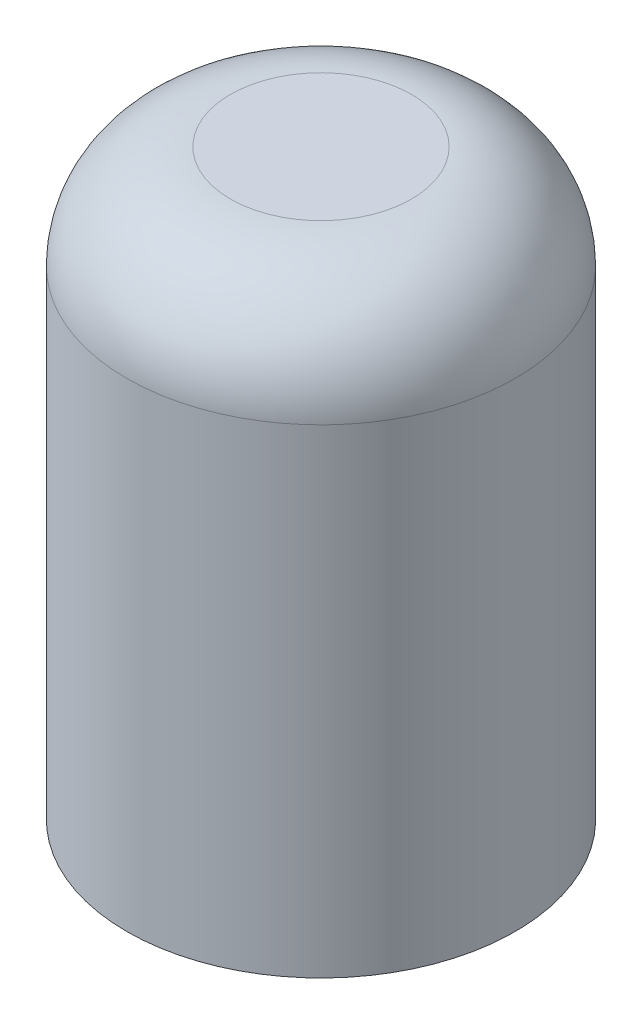
ISO-10303-21;
HEADER;
FILE_DESCRIPTION(('STEP AP214'),'2;1');
FILE_NAME('part.step','',(''),(''),'','','');
FILE_SCHEMA(('AUTOMOTIVE_DESIGN { 1 0 10303 214 1 1 1 1 }'));
ENDSEC;
DATA;
#1=APPLICATION_CONTEXT('core data for automotive mechanical design processes');
#2=APPLICATION_PROTOCOL_DEFINITION('international standard','automotive_design',2000,#1);
#3=PRODUCT_CONTEXT('',#1,'mechanical');
#4=PRODUCT('Part','Part','',(#3));
#5=PRODUCT_RELATED_PRODUCT_CATEGORY('part','',(#4));
#6=PRODUCT_DEFINITION_FORMATION('','',#4);
#7=PRODUCT_DEFINITION_CONTEXT('part definition',#1,'design');
#8=PRODUCT_DEFINITION('design','',#6,#7);
#9=PRODUCT_DEFINITION_SHAPE('','',#8);
#10=(LENGTH_UNIT() NAMED_UNIT(*) SI_UNIT(.MILLI.,.METRE.));
#11=(NAMED_UNIT(*) PLANE_ANGLE_UNIT() SI_UNIT($,.RADIAN.));
#12=(NAMED_UNIT(*) SI_UNIT($,.STERADIAN.) SOLID_ANGLE_UNIT());
#13=UNCERTAINTY_MEASURE_WITH_UNIT(LENGTH_MEASURE(1.E-05),#10,'distance_accuracy_value','');
#14=(GEOMETRIC_REPRESENTATION_CONTEXT(3) GLOBAL_UNCERTAINTY_ASSIGNED_CONTEXT((#13)) GLOBAL_UNIT_ASSIGNED_CONTEXT((#10,
#11,#12)) REPRESENTATION_CONTEXT('',''));
#15=CARTESIAN_POINT('',(0.,0.,0.));
#16=DIRECTION('',(0.,0.,1.));
#17=DIRECTION('',(1.,0.,0.));
#18=AXIS2_PLACEMENT_3D('',#15,#16,#17);
#19=CARTESIAN_POINT('',(0.,14.2875,0.));
#20=DIRECTION('',(0.,-1.,0.));
#21=DIRECTION('',(0.,0.,-1.));
#22=AXIS2_PLACEMENT_3D('',#19,#20,#21);
#23=CYLINDRICAL_SURFACE('',#22,4.7625);
#24=CARTESIAN_POINT('',(0.,11.7475,0.));
#25=DIRECTION('',(0.,1.,0.));
#26=DIRECTION('',(0.,0.,1.));
#27=AXIS2_PLACEMENT_3D('',#24,#25,#26);
#28=CIRCLE('',#27,4.7625);
#29=CARTESIAN_POINT('',(0.,11.7475,4.7625));
#30=VERTEX_POINT('',#29);
#31=EDGE_CURVE('E10',#30,#30,#28,.F.);
#32=ORIENTED_EDGE('',*,*,#31,.T.);
#33=EDGE_LOOP('',(#32));
#34=FACE_BOUND('',#33,.T.);
#35=CARTESIAN_POINT('',(0.,0.,0.));
#36=DIRECTION('',(0.,1.,0.));
#37=DIRECTION('',(0.,0.,1.));
#38=AXIS2_PLACEMENT_3D('',#35,#36,#37);
#39=CIRCLE('',#38,4.7625);
#40=CARTESIAN_POINT('',(0.,0.,4.7625));
#41=VERTEX_POINT('',#40);
#42=EDGE_CURVE('E48',#41,#41,#39,.T.);
#43=ORIENTED_EDGE('',*,*,#42,.T.);
#44=EDGE_LOOP('',(#43));
#45=FACE_BOUND('',#44,.T.);
#46=ADVANCED_FACE('F40',(#34,#45),#23,.T.);
#47=CARTESIAN_POINT('',(0.,14.2875,0.));
#48=DIRECTION('',(0.,1.,0.));
#49=DIRECTION('',(0.,0.,1.));
#50=AXIS2_PLACEMENT_3D('',#47,#48,#49);
#51=PLANE('',#50);
#52=CARTESIAN_POINT('',(0.,14.2875,0.));
#53=DIRECTION('',(0.,1.,0.));
#54=DIRECTION('',(0.,0.,1.));
#55=AXIS2_PLACEMENT_3D('',#52,#53,#54);
#56=CIRCLE('',#55,2.2225);
#57=CARTESIAN_POINT('',(0.,14.2875,2.2225));
#58=VERTEX_POINT('',#57);
#59=EDGE_CURVE('E42',#58,#58,#56,.T.);
#60=ORIENTED_EDGE('',*,*,#59,.T.);
#61=EDGE_LOOP('',(#60));
#62=FACE_BOUND('',#61,.T.);
#63=ADVANCED_FACE('F75',(#62),#51,.T.);
#64=CARTESIAN_POINT('',(0.,0.,0.));
#65=DIRECTION('',(0.,1.,0.));
#66=DIRECTION('',(0.,0.,1.));
#67=AXIS2_PLACEMENT_3D('',#64,#65,#66);
#68=PLANE('',#67);
#69=CARTESIAN_POINT('',(0.,0.,0.));
#70=DIRECTION('',(0.,-1.,0.));
#71=DIRECTION('',(0.,0.,-1.));
#72=AXIS2_PLACEMENT_3D('',#69,#70,#71);
#73=CIRCLE('',#72,1.5875);
#74=CARTESIAN_POINT('',(0.,0.,-1.5875));
#75=VERTEX_POINT('',#74);
#76=EDGE_CURVE('E54',#75,#75,#73,.T.);
#77=ORIENTED_EDGE('',*,*,#76,.F.);
#78=EDGE_LOOP('',(#77));
#79=FACE_BOUND('',#78,.T.);
#80=ORIENTED_EDGE('',*,*,#42,.F.);
#81=EDGE_LOOP('',(#80));
#82=FACE_BOUND('',#81,.T.);
#83=ADVANCED_FACE('F68',(#79,#82),#68,.F.);
#84=CARTESIAN_POINT('',(0.,11.7475,0.));
#85=DIRECTION('',(0.,1.,0.));
#86=DIRECTION('',(0.,0.,1.));
#87=AXIS2_PLACEMENT_3D('',#84,#85,#86);
#88=DEGENERATE_TOROIDAL_SURFACE('',#87,2.2225,2.54,.T.);
#89=ORIENTED_EDGE('',*,*,#31,.F.);
#90=EDGE_LOOP('',(#89));
#91=FACE_BOUND('',#90,.T.);
#92=ORIENTED_EDGE('',*,*,#59,.F.);
#93=EDGE_LOOP('',(#92));
#94=FACE_BOUND('',#93,.T.);
#95=ADVANCED_FACE('F39',(#91,#94),#88,.T.);
#96=CARTESIAN_POINT('',(0.,6.35,0.));
#97=DIRECTION('',(0.,-1.,0.));
#98=DIRECTION('',(0.,0.,-1.));
#99=AXIS2_PLACEMENT_3D('',#96,#97,#98);
#100=CYLINDRICAL_SURFACE('',#99,1.5875);
#101=CARTESIAN_POINT('',(0.,6.35,0.));
#102=DIRECTION('',(0.,-1.,0.));
#103=DIRECTION('',(0.,0.,-1.));
#104=AXIS2_PLACEMENT_3D('',#101,#102,#103);
#105=CIRCLE('',#104,1.5875);
#106=CARTESIAN_POINT('',(0.,6.35,-1.5875));
#107=VERTEX_POINT('',#106);
#108=EDGE_CURVE('E55',#107,#107,#105,.T.);
#109=ORIENTED_EDGE('',*,*,#108,.F.);
#110=EDGE_LOOP('',(#109));
#111=FACE_BOUND('',#110,.T.);
#112=ORIENTED_EDGE('',*,*,#76,.T.);
#113=EDGE_LOOP('',(#112));
#114=FACE_BOUND('',#113,.T.);
#115=ADVANCED_FACE('F62',(#111,#114),#100,.F.);
#116=CARTESIAN_POINT('',(0.,6.35,0.));
#117=DIRECTION('',(0.,-1.,0.));
#118=DIRECTION('',(0.,0.,-1.));
#119=AXIS2_PLACEMENT_3D('',#116,#117,#118);
#120=PLANE('',#119);
#121=ORIENTED_EDGE('',*,*,#108,.T.);
#122=EDGE_LOOP('',(#121));
#123=FACE_BOUND('',#122,.T.);
#124=ADVANCED_FACE('F61',(#123),#120,.T.);
#125=CLOSED_SHELL('',(#46,#63,#83,#95,#115,#124));
#126=MANIFOLD_SOLID_BREP('B2',#125);
#127=ADVANCED_BREP_SHAPE_REPRESENTATION('',(#18,#126),#14);
#128=SHAPE_DEFINITION_REPRESENTATION(#9,#127);
ENDSEC;
END-ISO-10303-21;
